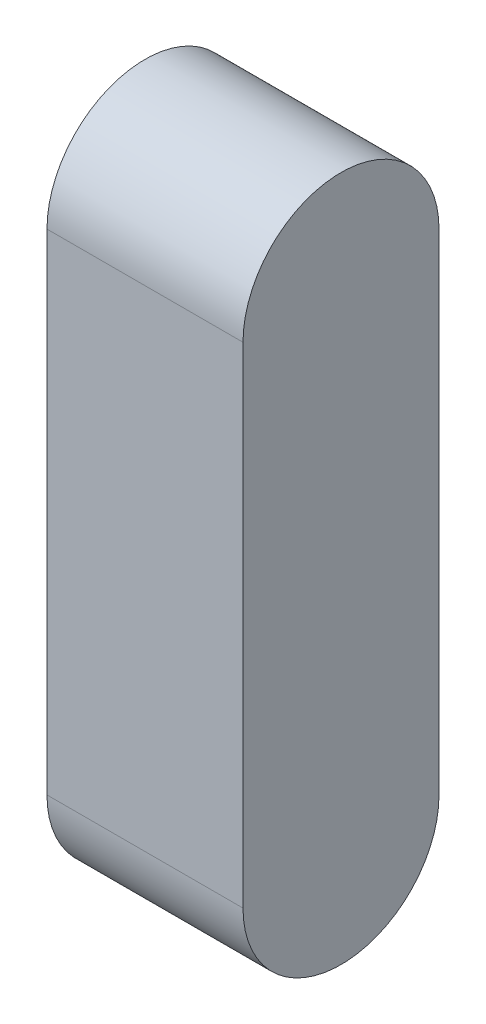
ISO-10303-21;
HEADER;
FILE_DESCRIPTION(('STEP AP214'),'2;1');
FILE_NAME('part.step','',(''),(''),'','','');
FILE_SCHEMA(('AUTOMOTIVE_DESIGN { 1 0 10303 214 1 1 1 1 }'));
ENDSEC;
DATA;
#1=APPLICATION_CONTEXT('core data for automotive mechanical design processes');
#2=APPLICATION_PROTOCOL_DEFINITION('international standard','automotive_design',2000,#1);
#3=PRODUCT_CONTEXT('',#1,'mechanical');
#4=PRODUCT('Part','Part','',(#3));
#5=PRODUCT_RELATED_PRODUCT_CATEGORY('part','',(#4));
#6=PRODUCT_DEFINITION_FORMATION('','',#4);
#7=PRODUCT_DEFINITION_CONTEXT('part definition',#1,'design');
#8=PRODUCT_DEFINITION('design','',#6,#7);
#9=PRODUCT_DEFINITION_SHAPE('','',#8);
#10=(LENGTH_UNIT() NAMED_UNIT(*) SI_UNIT(.MILLI.,.METRE.));
#11=(NAMED_UNIT(*) PLANE_ANGLE_UNIT() SI_UNIT($,.RADIAN.));
#12=(NAMED_UNIT(*) SI_UNIT($,.STERADIAN.) SOLID_ANGLE_UNIT());
#13=UNCERTAINTY_MEASURE_WITH_UNIT(LENGTH_MEASURE(1.E-05),#10,'distance_accuracy_value','');
#14=(GEOMETRIC_REPRESENTATION_CONTEXT(3) GLOBAL_UNCERTAINTY_ASSIGNED_CONTEXT((#13)) GLOBAL_UNIT_ASSIGNED_CONTEXT((#10,
#11,#12)) REPRESENTATION_CONTEXT('',''));
#15=CARTESIAN_POINT('',(0.,0.,0.));
#16=DIRECTION('',(0.,0.,1.));
#17=DIRECTION('',(1.,0.,0.));
#18=AXIS2_PLACEMENT_3D('',#15,#16,#17);
#19=CARTESIAN_POINT('',(2.,-5.,0.));
#20=DIRECTION('',(-1.,0.,0.));
#21=DIRECTION('',(0.,0.,1.));
#22=AXIS2_PLACEMENT_3D('',#19,#20,#21);
#23=CYLINDRICAL_SURFACE('',#22,2.);
#24=CARTESIAN_POINT('',(-2.,-5.,0.));
#25=DIRECTION('',(1.,0.,0.));
#26=DIRECTION('',(0.,0.,-1.));
#27=AXIS2_PLACEMENT_3D('',#24,#25,#26);
#28=CIRCLE('',#27,2.);
#29=CARTESIAN_POINT('',(-2.,-5.,2.));
#30=VERTEX_POINT('',#29);
#31=CARTESIAN_POINT('',(-2.,-5.,-2.));
#32=VERTEX_POINT('',#31);
#33=EDGE_CURVE('E106',#30,#32,#28,.T.);
#34=ORIENTED_EDGE('',*,*,#33,.T.);
#35=DIRECTION('',(-1.,0.,0.));
#36=VECTOR('',#35,1.);
#37=CARTESIAN_POINT('',(2.,-5.,-2.));
#38=LINE('',#37,#36);
#39=CARTESIAN_POINT('',(2.,-5.,-2.));
#40=VERTEX_POINT('',#39);
#41=EDGE_CURVE('E11',#40,#32,#38,.T.);
#42=ORIENTED_EDGE('',*,*,#41,.F.);
#43=CARTESIAN_POINT('',(2.,-5.,0.));
#44=DIRECTION('',(1.,0.,0.));
#45=DIRECTION('',(0.,0.,-1.));
#46=AXIS2_PLACEMENT_3D('',#43,#44,#45);
#47=CIRCLE('',#46,2.);
#48=CARTESIAN_POINT('',(2.,-5.,2.));
#49=VERTEX_POINT('',#48);
#50=EDGE_CURVE('E94',#49,#40,#47,.T.);
#51=ORIENTED_EDGE('',*,*,#50,.F.);
#52=DIRECTION('',(-1.,0.,0.));
#53=VECTOR('',#52,1.);
#54=CARTESIAN_POINT('',(2.,-5.,2.));
#55=LINE('',#54,#53);
#56=EDGE_CURVE('E102',#49,#30,#55,.T.);
#57=ORIENTED_EDGE('',*,*,#56,.T.);
#58=EDGE_LOOP('',(#34,#42,#51,#57));
#59=FACE_BOUND('',#58,.T.);
#60=ADVANCED_FACE('F43',(#59),#23,.T.);
#61=CARTESIAN_POINT('',(2.,-5.,-2.));
#62=DIRECTION('',(0.,0.,1.));
#63=DIRECTION('',(0.,-1.,0.));
#64=AXIS2_PLACEMENT_3D('',#61,#62,#63);
#65=PLANE('',#64);
#66=DIRECTION('',(0.,1.,0.));
#67=VECTOR('',#66,1.);
#68=CARTESIAN_POINT('',(-2.,-5.,-2.));
#69=LINE('',#68,#67);
#70=CARTESIAN_POINT('',(-2.,5.,-2.));
#71=VERTEX_POINT('',#70);
#72=EDGE_CURVE('E98',#32,#71,#69,.T.);
#73=ORIENTED_EDGE('',*,*,#72,.T.);
#74=DIRECTION('',(-1.,0.,0.));
#75=VECTOR('',#74,1.);
#76=CARTESIAN_POINT('',(2.,5.,-2.));
#77=LINE('',#76,#75);
#78=CARTESIAN_POINT('',(2.,5.,-2.));
#79=VERTEX_POINT('',#78);
#80=EDGE_CURVE('E51',#79,#71,#77,.T.);
#81=ORIENTED_EDGE('',*,*,#80,.F.);
#82=DIRECTION('',(0.,1.,0.));
#83=VECTOR('',#82,1.);
#84=CARTESIAN_POINT('',(2.,-5.,-2.));
#85=LINE('',#84,#83);
#86=EDGE_CURVE('E89',#40,#79,#85,.T.);
#87=ORIENTED_EDGE('',*,*,#86,.F.);
#88=ORIENTED_EDGE('',*,*,#41,.T.);
#89=EDGE_LOOP('',(#73,#81,#87,#88));
#90=FACE_BOUND('',#89,.T.);
#91=ADVANCED_FACE('F97',(#90),#65,.F.);
#92=CARTESIAN_POINT('',(2.,5.,0.));
#93=DIRECTION('',(-1.,0.,0.));
#94=DIRECTION('',(0.,0.,1.));
#95=AXIS2_PLACEMENT_3D('',#92,#93,#94);
#96=CYLINDRICAL_SURFACE('',#95,2.);
#97=CARTESIAN_POINT('',(-2.,5.,0.));
#98=DIRECTION('',(1.,0.,0.));
#99=DIRECTION('',(0.,0.,-1.));
#100=AXIS2_PLACEMENT_3D('',#97,#98,#99);
#101=CIRCLE('',#100,2.);
#102=CARTESIAN_POINT('',(-2.,5.,2.));
#103=VERTEX_POINT('',#102);
#104=EDGE_CURVE('E76',#71,#103,#101,.T.);
#105=ORIENTED_EDGE('',*,*,#104,.T.);
#106=DIRECTION('',(-1.,0.,0.));
#107=VECTOR('',#106,1.);
#108=CARTESIAN_POINT('',(2.,5.,2.));
#109=LINE('',#108,#107);
#110=CARTESIAN_POINT('',(2.,5.,2.));
#111=VERTEX_POINT('',#110);
#112=EDGE_CURVE('E99',#111,#103,#109,.T.);
#113=ORIENTED_EDGE('',*,*,#112,.F.);
#114=CARTESIAN_POINT('',(2.,5.,0.));
#115=DIRECTION('',(1.,0.,0.));
#116=DIRECTION('',(0.,0.,-1.));
#117=AXIS2_PLACEMENT_3D('',#114,#115,#116);
#118=CIRCLE('',#117,2.);
#119=EDGE_CURVE('E92',#79,#111,#118,.T.);
#120=ORIENTED_EDGE('',*,*,#119,.F.);
#121=ORIENTED_EDGE('',*,*,#80,.T.);
#122=EDGE_LOOP('',(#105,#113,#120,#121));
#123=FACE_BOUND('',#122,.T.);
#124=ADVANCED_FACE('F100',(#123),#96,.T.);
#125=CARTESIAN_POINT('',(2.,-5.,2.));
#126=DIRECTION('',(0.,0.,-1.));
#127=DIRECTION('',(0.,1.,0.));
#128=AXIS2_PLACEMENT_3D('',#125,#126,#127);
#129=PLANE('',#128);
#130=DIRECTION('',(0.,-1.,0.));
#131=VECTOR('',#130,1.);
#132=CARTESIAN_POINT('',(-2.,-5.,2.));
#133=LINE('',#132,#131);
#134=EDGE_CURVE('E82',#103,#30,#133,.T.);
#135=ORIENTED_EDGE('',*,*,#134,.T.);
#136=ORIENTED_EDGE('',*,*,#56,.F.);
#137=DIRECTION('',(0.,-1.,0.));
#138=VECTOR('',#137,1.);
#139=CARTESIAN_POINT('',(2.,-5.,2.));
#140=LINE('',#139,#138);
#141=EDGE_CURVE('E59',#111,#49,#140,.T.);
#142=ORIENTED_EDGE('',*,*,#141,.F.);
#143=ORIENTED_EDGE('',*,*,#112,.T.);
#144=EDGE_LOOP('',(#135,#136,#142,#143));
#145=FACE_BOUND('',#144,.T.);
#146=ADVANCED_FACE('F113',(#145),#129,.F.);
#147=CARTESIAN_POINT('',(2.,-5.,0.));
#148=DIRECTION('',(1.,0.,0.));
#149=DIRECTION('',(0.,0.,-1.));
#150=AXIS2_PLACEMENT_3D('',#147,#148,#149);
#151=PLANE('',#150);
#152=ORIENTED_EDGE('',*,*,#50,.T.);
#153=ORIENTED_EDGE('',*,*,#86,.T.);
#154=ORIENTED_EDGE('',*,*,#119,.T.);
#155=ORIENTED_EDGE('',*,*,#141,.T.);
#156=EDGE_LOOP('',(#152,#153,#154,#155));
#157=FACE_BOUND('',#156,.T.);
#158=ADVANCED_FACE('F90',(#157),#151,.T.);
#159=CARTESIAN_POINT('',(-2.,-5.,0.));
#160=DIRECTION('',(1.,0.,0.));
#161=DIRECTION('',(0.,0.,-1.));
#162=AXIS2_PLACEMENT_3D('',#159,#160,#161);
#163=PLANE('',#162);
#164=ORIENTED_EDGE('',*,*,#33,.F.);
#165=ORIENTED_EDGE('',*,*,#134,.F.);
#166=ORIENTED_EDGE('',*,*,#104,.F.);
#167=ORIENTED_EDGE('',*,*,#72,.F.);
#168=EDGE_LOOP('',(#164,#165,#166,#167));
#169=FACE_BOUND('',#168,.T.);
#170=ADVANCED_FACE('F116',(#169),#163,.F.);
#171=CLOSED_SHELL('',(#60,#91,#124,#146,#158,#170));
#172=MANIFOLD_SOLID_BREP('B2',#171);
#173=ADVANCED_BREP_SHAPE_REPRESENTATION('',(#18,#172),#14);
#174=SHAPE_DEFINITION_REPRESENTATION(#9,#173);
ENDSEC;
END-ISO-10303-21;
